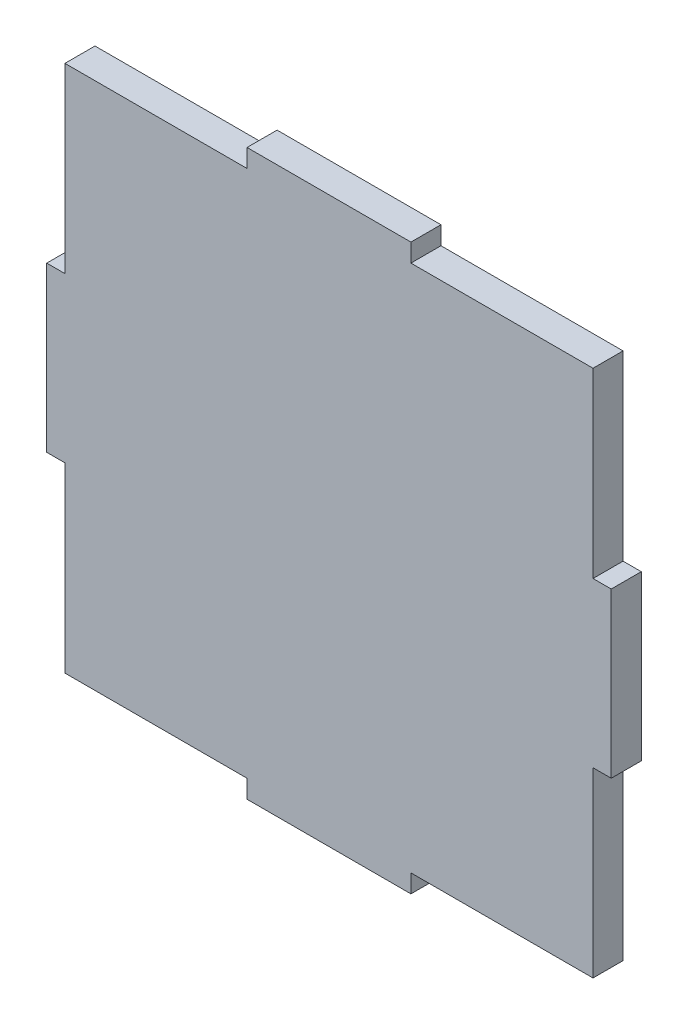
ISO-10303-21;
HEADER;
FILE_DESCRIPTION(('STEP AP214'),'2;1');
FILE_NAME('part.step','',(''),(''),'','','');
FILE_SCHEMA(('AUTOMOTIVE_DESIGN { 1 0 10303 214 1 1 1 1 }'));
ENDSEC;
DATA;
#1=APPLICATION_CONTEXT('core data for automotive mechanical design processes');
#2=APPLICATION_PROTOCOL_DEFINITION('international standard','automotive_design',2000,#1);
#3=PRODUCT_CONTEXT('',#1,'mechanical');
#4=PRODUCT('Part','Part','',(#3));
#5=PRODUCT_RELATED_PRODUCT_CATEGORY('part','',(#4));
#6=PRODUCT_DEFINITION_FORMATION('','',#4);
#7=PRODUCT_DEFINITION_CONTEXT('part definition',#1,'design');
#8=PRODUCT_DEFINITION('design','',#6,#7);
#9=PRODUCT_DEFINITION_SHAPE('','',#8);
#10=(LENGTH_UNIT() NAMED_UNIT(*) SI_UNIT(.MILLI.,.METRE.));
#11=(NAMED_UNIT(*) PLANE_ANGLE_UNIT() SI_UNIT($,.RADIAN.));
#12=(NAMED_UNIT(*) SI_UNIT($,.STERADIAN.) SOLID_ANGLE_UNIT());
#13=UNCERTAINTY_MEASURE_WITH_UNIT(LENGTH_MEASURE(1.E-05),#10,'distance_accuracy_value','');
#14=(GEOMETRIC_REPRESENTATION_CONTEXT(3) GLOBAL_UNCERTAINTY_ASSIGNED_CONTEXT((#13)) GLOBAL_UNIT_ASSIGNED_CONTEXT((#10,
#11,#12)) REPRESENTATION_CONTEXT('',''));
#15=CARTESIAN_POINT('',(0.,0.,0.));
#16=DIRECTION('',(0.,0.,1.));
#17=DIRECTION('',(1.,0.,0.));
#18=AXIS2_PLACEMENT_3D('',#15,#16,#17);
#19=CARTESIAN_POINT('',(0.,1.,1.65));
#20=DIRECTION('',(0.,1.,0.));
#21=DIRECTION('',(0.,0.,1.));
#22=AXIS2_PLACEMENT_3D('',#19,#20,#21);
#23=PLANE('',#22);
#24=DIRECTION('',(1.,0.,0.));
#25=VECTOR('',#24,1.);
#26=CARTESIAN_POINT('',(0.,1.,0.));
#27=LINE('',#26,#25);
#28=CARTESIAN_POINT('',(1.,1.,0.));
#29=VERTEX_POINT('',#28);
#30=CARTESIAN_POINT('',(11.,1.,0.));
#31=VERTEX_POINT('',#30);
#32=EDGE_CURVE('E209',#29,#31,#27,.T.);
#33=ORIENTED_EDGE('',*,*,#32,.T.);
#34=DIRECTION('',(0.,0.,-1.));
#35=VECTOR('',#34,1.);
#36=CARTESIAN_POINT('',(11.,1.,1.65));
#37=LINE('',#36,#35);
#38=CARTESIAN_POINT('',(11.,1.,1.65));
#39=VERTEX_POINT('',#38);
#40=EDGE_CURVE('E11',#39,#31,#37,.T.);
#41=ORIENTED_EDGE('',*,*,#40,.F.);
#42=DIRECTION('',(1.,0.,0.));
#43=VECTOR('',#42,1.);
#44=CARTESIAN_POINT('',(0.,1.,1.65));
#45=LINE('',#44,#43);
#46=CARTESIAN_POINT('',(1.,1.,1.65));
#47=VERTEX_POINT('',#46);
#48=EDGE_CURVE('E309',#47,#39,#45,.T.);
#49=ORIENTED_EDGE('',*,*,#48,.F.);
#50=DIRECTION('',(0.,0.,-1.));
#51=VECTOR('',#50,1.);
#52=CARTESIAN_POINT('',(1.,1.,1.65));
#53=LINE('',#52,#51);
#54=EDGE_CURVE('E55',#47,#29,#53,.T.);
#55=ORIENTED_EDGE('',*,*,#54,.T.);
#56=EDGE_LOOP('',(#33,#41,#49,#55));
#57=FACE_BOUND('',#56,.T.);
#58=ADVANCED_FACE('F38',(#57),#23,.F.);
#59=CARTESIAN_POINT('',(11.,0.,1.65));
#60=DIRECTION('',(1.,0.,0.));
#61=DIRECTION('',(0.,0.,-1.));
#62=AXIS2_PLACEMENT_3D('',#59,#60,#61);
#63=PLANE('',#62);
#64=DIRECTION('',(0.,-1.,0.));
#65=VECTOR('',#64,1.);
#66=CARTESIAN_POINT('',(11.,0.,0.));
#67=LINE('',#66,#65);
#68=CARTESIAN_POINT('',(11.,0.,0.));
#69=VERTEX_POINT('',#68);
#70=EDGE_CURVE('E211',#31,#69,#67,.T.);
#71=ORIENTED_EDGE('',*,*,#70,.T.);
#72=DIRECTION('',(0.,0.,-1.));
#73=VECTOR('',#72,1.);
#74=CARTESIAN_POINT('',(11.,0.,1.65));
#75=LINE('',#74,#73);
#76=CARTESIAN_POINT('',(11.,0.,1.65));
#77=VERTEX_POINT('',#76);
#78=EDGE_CURVE('E47',#77,#69,#75,.T.);
#79=ORIENTED_EDGE('',*,*,#78,.F.);
#80=DIRECTION('',(0.,-1.,0.));
#81=VECTOR('',#80,1.);
#82=CARTESIAN_POINT('',(11.,0.,1.65));
#83=LINE('',#82,#81);
#84=EDGE_CURVE('E130',#39,#77,#83,.T.);
#85=ORIENTED_EDGE('',*,*,#84,.F.);
#86=ORIENTED_EDGE('',*,*,#40,.T.);
#87=EDGE_LOOP('',(#71,#79,#85,#86));
#88=FACE_BOUND('',#87,.T.);
#89=ADVANCED_FACE('F40',(#88),#63,.F.);
#90=CARTESIAN_POINT('',(0.,0.,1.65));
#91=DIRECTION('',(0.,1.,0.));
#92=DIRECTION('',(0.,0.,1.));
#93=AXIS2_PLACEMENT_3D('',#90,#91,#92);
#94=PLANE('',#93);
#95=DIRECTION('',(1.,0.,0.));
#96=VECTOR('',#95,1.);
#97=CARTESIAN_POINT('',(0.,0.,0.));
#98=LINE('',#97,#96);
#99=CARTESIAN_POINT('',(20.,0.,0.));
#100=VERTEX_POINT('',#99);
#101=EDGE_CURVE('E214',#69,#100,#98,.T.);
#102=ORIENTED_EDGE('',*,*,#101,.T.);
#103=DIRECTION('',(0.,0.,-1.));
#104=VECTOR('',#103,1.);
#105=CARTESIAN_POINT('',(20.,0.,1.65));
#106=LINE('',#105,#104);
#107=CARTESIAN_POINT('',(20.,0.,1.65));
#108=VERTEX_POINT('',#107);
#109=EDGE_CURVE('E286',#108,#100,#106,.T.);
#110=ORIENTED_EDGE('',*,*,#109,.F.);
#111=DIRECTION('',(1.,0.,0.));
#112=VECTOR('',#111,1.);
#113=CARTESIAN_POINT('',(0.,0.,1.65));
#114=LINE('',#113,#112);
#115=EDGE_CURVE('E293',#77,#108,#114,.T.);
#116=ORIENTED_EDGE('',*,*,#115,.F.);
#117=ORIENTED_EDGE('',*,*,#78,.T.);
#118=EDGE_LOOP('',(#102,#110,#116,#117));
#119=FACE_BOUND('',#118,.T.);
#120=ADVANCED_FACE('F291',(#119),#94,.F.);
#121=CARTESIAN_POINT('',(20.,0.,1.65));
#122=DIRECTION('',(1.,0.,0.));
#123=DIRECTION('',(0.,0.,-1.));
#124=AXIS2_PLACEMENT_3D('',#121,#122,#123);
#125=PLANE('',#124);
#126=DIRECTION('',(0.,-1.,0.));
#127=VECTOR('',#126,1.);
#128=CARTESIAN_POINT('',(20.,0.,0.));
#129=LINE('',#128,#127);
#130=CARTESIAN_POINT('',(20.,1.,0.));
#131=VERTEX_POINT('',#130);
#132=EDGE_CURVE('E217',#131,#100,#129,.T.);
#133=ORIENTED_EDGE('',*,*,#132,.F.);
#134=DIRECTION('',(0.,0.,-1.));
#135=VECTOR('',#134,1.);
#136=CARTESIAN_POINT('',(20.,1.,1.65));
#137=LINE('',#136,#135);
#138=CARTESIAN_POINT('',(20.,1.,1.65));
#139=VERTEX_POINT('',#138);
#140=EDGE_CURVE('E284',#139,#131,#137,.T.);
#141=ORIENTED_EDGE('',*,*,#140,.F.);
#142=DIRECTION('',(0.,-1.,0.));
#143=VECTOR('',#142,1.);
#144=CARTESIAN_POINT('',(20.,0.,1.65));
#145=LINE('',#144,#143);
#146=EDGE_CURVE('E304',#139,#108,#145,.T.);
#147=ORIENTED_EDGE('',*,*,#146,.T.);
#148=ORIENTED_EDGE('',*,*,#109,.T.);
#149=EDGE_LOOP('',(#133,#141,#147,#148));
#150=FACE_BOUND('',#149,.T.);
#151=ADVANCED_FACE('F300',(#150),#125,.T.);
#152=CARTESIAN_POINT('',(30.,1.,0.));
#153=VERTEX_POINT('',#152);
#154=EDGE_CURVE('E212',#131,#153,#27,.T.);
#155=ORIENTED_EDGE('',*,*,#154,.T.);
#156=DIRECTION('',(0.,0.,-1.));
#157=VECTOR('',#156,1.);
#158=CARTESIAN_POINT('',(30.,1.,1.65));
#159=LINE('',#158,#157);
#160=CARTESIAN_POINT('',(30.,1.,1.65));
#161=VERTEX_POINT('',#160);
#162=EDGE_CURVE('E281',#161,#153,#159,.T.);
#163=ORIENTED_EDGE('',*,*,#162,.F.);
#164=EDGE_CURVE('E305',#139,#161,#45,.T.);
#165=ORIENTED_EDGE('',*,*,#164,.F.);
#166=ORIENTED_EDGE('',*,*,#140,.T.);
#167=EDGE_LOOP('',(#155,#163,#165,#166));
#168=FACE_BOUND('',#167,.T.);
#169=ADVANCED_FACE('F344',(#168),#23,.F.);
#170=CARTESIAN_POINT('',(30.,0.,1.65));
#171=DIRECTION('',(-1.,0.,0.));
#172=DIRECTION('',(0.,0.,1.));
#173=AXIS2_PLACEMENT_3D('',#170,#171,#172);
#174=PLANE('',#173);
#175=DIRECTION('',(0.,1.,0.));
#176=VECTOR('',#175,1.);
#177=CARTESIAN_POINT('',(30.,0.,0.));
#178=LINE('',#177,#176);
#179=CARTESIAN_POINT('',(30.,11.,0.));
#180=VERTEX_POINT('',#179);
#181=EDGE_CURVE('E220',#153,#180,#178,.T.);
#182=ORIENTED_EDGE('',*,*,#181,.T.);
#183=DIRECTION('',(0.,0.,-1.));
#184=VECTOR('',#183,1.);
#185=CARTESIAN_POINT('',(30.,11.,1.65));
#186=LINE('',#185,#184);
#187=CARTESIAN_POINT('',(30.,11.,1.65));
#188=VERTEX_POINT('',#187);
#189=EDGE_CURVE('E278',#188,#180,#186,.T.);
#190=ORIENTED_EDGE('',*,*,#189,.F.);
#191=DIRECTION('',(0.,1.,0.));
#192=VECTOR('',#191,1.);
#193=CARTESIAN_POINT('',(30.,0.,1.65));
#194=LINE('',#193,#192);
#195=EDGE_CURVE('E307',#161,#188,#194,.T.);
#196=ORIENTED_EDGE('',*,*,#195,.F.);
#197=ORIENTED_EDGE('',*,*,#162,.T.);
#198=EDGE_LOOP('',(#182,#190,#196,#197));
#199=FACE_BOUND('',#198,.T.);
#200=ADVANCED_FACE('F350',(#199),#174,.F.);
#201=CARTESIAN_POINT('',(0.,11.,1.65));
#202=DIRECTION('',(0.,1.,0.));
#203=DIRECTION('',(0.,0.,1.));
#204=AXIS2_PLACEMENT_3D('',#201,#202,#203);
#205=PLANE('',#204);
#206=DIRECTION('',(1.,0.,0.));
#207=VECTOR('',#206,1.);
#208=CARTESIAN_POINT('',(0.,11.,0.));
#209=LINE('',#208,#207);
#210=CARTESIAN_POINT('',(31.,11.,0.));
#211=VERTEX_POINT('',#210);
#212=EDGE_CURVE('E222',#180,#211,#209,.T.);
#213=ORIENTED_EDGE('',*,*,#212,.T.);
#214=DIRECTION('',(0.,0.,-1.));
#215=VECTOR('',#214,1.);
#216=CARTESIAN_POINT('',(31.,11.,1.65));
#217=LINE('',#216,#215);
#218=CARTESIAN_POINT('',(31.,11.,1.65));
#219=VERTEX_POINT('',#218);
#220=EDGE_CURVE('E275',#219,#211,#217,.T.);
#221=ORIENTED_EDGE('',*,*,#220,.F.);
#222=DIRECTION('',(1.,0.,0.));
#223=VECTOR('',#222,1.);
#224=CARTESIAN_POINT('',(0.,11.,1.65));
#225=LINE('',#224,#223);
#226=EDGE_CURVE('E314',#188,#219,#225,.T.);
#227=ORIENTED_EDGE('',*,*,#226,.F.);
#228=ORIENTED_EDGE('',*,*,#189,.T.);
#229=EDGE_LOOP('',(#213,#221,#227,#228));
#230=FACE_BOUND('',#229,.T.);
#231=ADVANCED_FACE('F356',(#230),#205,.F.);
#232=CARTESIAN_POINT('',(31.,0.,1.65));
#233=DIRECTION('',(-1.,0.,0.));
#234=DIRECTION('',(0.,0.,1.));
#235=AXIS2_PLACEMENT_3D('',#232,#233,#234);
#236=PLANE('',#235);
#237=DIRECTION('',(0.,1.,0.));
#238=VECTOR('',#237,1.);
#239=CARTESIAN_POINT('',(31.,0.,0.));
#240=LINE('',#239,#238);
#241=CARTESIAN_POINT('',(31.,20.,0.));
#242=VERTEX_POINT('',#241);
#243=EDGE_CURVE('E225',#211,#242,#240,.T.);
#244=ORIENTED_EDGE('',*,*,#243,.T.);
#245=DIRECTION('',(0.,0.,-1.));
#246=VECTOR('',#245,1.);
#247=CARTESIAN_POINT('',(31.,20.,1.65));
#248=LINE('',#247,#246);
#249=CARTESIAN_POINT('',(31.,20.,1.65));
#250=VERTEX_POINT('',#249);
#251=EDGE_CURVE('E273',#250,#242,#248,.T.);
#252=ORIENTED_EDGE('',*,*,#251,.F.);
#253=DIRECTION('',(0.,1.,0.));
#254=VECTOR('',#253,1.);
#255=CARTESIAN_POINT('',(31.,0.,1.65));
#256=LINE('',#255,#254);
#257=EDGE_CURVE('E317',#219,#250,#256,.T.);
#258=ORIENTED_EDGE('',*,*,#257,.F.);
#259=ORIENTED_EDGE('',*,*,#220,.T.);
#260=EDGE_LOOP('',(#244,#252,#258,#259));
#261=FACE_BOUND('',#260,.T.);
#262=ADVANCED_FACE('F370',(#261),#236,.F.);
#263=CARTESIAN_POINT('',(0.,20.,1.65));
#264=DIRECTION('',(0.,1.,0.));
#265=DIRECTION('',(0.,0.,1.));
#266=AXIS2_PLACEMENT_3D('',#263,#264,#265);
#267=PLANE('',#266);
#268=DIRECTION('',(1.,0.,0.));
#269=VECTOR('',#268,1.);
#270=CARTESIAN_POINT('',(0.,20.,0.));
#271=LINE('',#270,#269);
#272=CARTESIAN_POINT('',(30.,20.,0.));
#273=VERTEX_POINT('',#272);
#274=EDGE_CURVE('E228',#273,#242,#271,.T.);
#275=ORIENTED_EDGE('',*,*,#274,.F.);
#276=DIRECTION('',(0.,0.,-1.));
#277=VECTOR('',#276,1.);
#278=CARTESIAN_POINT('',(30.,20.,1.65));
#279=LINE('',#278,#277);
#280=CARTESIAN_POINT('',(30.,20.,1.65));
#281=VERTEX_POINT('',#280);
#282=EDGE_CURVE('E271',#281,#273,#279,.T.);
#283=ORIENTED_EDGE('',*,*,#282,.F.);
#284=DIRECTION('',(1.,0.,0.));
#285=VECTOR('',#284,1.);
#286=CARTESIAN_POINT('',(0.,20.,1.65));
#287=LINE('',#286,#285);
#288=EDGE_CURVE('E319',#281,#250,#287,.T.);
#289=ORIENTED_EDGE('',*,*,#288,.T.);
#290=ORIENTED_EDGE('',*,*,#251,.T.);
#291=EDGE_LOOP('',(#275,#283,#289,#290));
#292=FACE_BOUND('',#291,.T.);
#293=ADVANCED_FACE('F378',(#292),#267,.T.);
#294=CARTESIAN_POINT('',(30.,30.,0.));
#295=VERTEX_POINT('',#294);
#296=EDGE_CURVE('E223',#273,#295,#178,.T.);
#297=ORIENTED_EDGE('',*,*,#296,.T.);
#298=DIRECTION('',(0.,0.,-1.));
#299=VECTOR('',#298,1.);
#300=CARTESIAN_POINT('',(30.,30.,1.65));
#301=LINE('',#300,#299);
#302=CARTESIAN_POINT('',(30.,30.,1.65));
#303=VERTEX_POINT('',#302);
#304=EDGE_CURVE('E269',#303,#295,#301,.T.);
#305=ORIENTED_EDGE('',*,*,#304,.F.);
#306=EDGE_CURVE('E315',#281,#303,#194,.T.);
#307=ORIENTED_EDGE('',*,*,#306,.F.);
#308=ORIENTED_EDGE('',*,*,#282,.T.);
#309=EDGE_LOOP('',(#297,#305,#307,#308));
#310=FACE_BOUND('',#309,.T.);
#311=ADVANCED_FACE('F359',(#310),#174,.F.);
#312=CARTESIAN_POINT('',(0.,30.,1.65));
#313=DIRECTION('',(0.,1.,0.));
#314=DIRECTION('',(-1.,0.,0.));
#315=AXIS2_PLACEMENT_3D('',#312,#313,#314);
#316=PLANE('',#315);
#317=DIRECTION('',(1.,0.,0.));
#318=VECTOR('',#317,1.);
#319=CARTESIAN_POINT('',(0.,30.,0.));
#320=LINE('',#319,#318);
#321=CARTESIAN_POINT('',(20.,30.,0.));
#322=VERTEX_POINT('',#321);
#323=EDGE_CURVE('E231',#322,#295,#320,.T.);
#324=ORIENTED_EDGE('',*,*,#323,.F.);
#325=DIRECTION('',(0.,0.,-1.));
#326=VECTOR('',#325,1.);
#327=CARTESIAN_POINT('',(20.,30.,1.65));
#328=LINE('',#327,#326);
#329=CARTESIAN_POINT('',(20.,30.,1.65));
#330=VERTEX_POINT('',#329);
#331=EDGE_CURVE('E267',#330,#322,#328,.T.);
#332=ORIENTED_EDGE('',*,*,#331,.F.);
#333=DIRECTION('',(1.,0.,0.));
#334=VECTOR('',#333,1.);
#335=CARTESIAN_POINT('',(0.,30.,1.65));
#336=LINE('',#335,#334);
#337=EDGE_CURVE('E322',#330,#303,#336,.T.);
#338=ORIENTED_EDGE('',*,*,#337,.T.);
#339=ORIENTED_EDGE('',*,*,#304,.T.);
#340=EDGE_LOOP('',(#324,#332,#338,#339));
#341=FACE_BOUND('',#340,.T.);
#342=ADVANCED_FACE('F384',(#341),#316,.T.);
#343=CARTESIAN_POINT('',(20.,0.,1.65));
#344=DIRECTION('',(1.,0.,0.));
#345=DIRECTION('',(0.,0.,-1.));
#346=AXIS2_PLACEMENT_3D('',#343,#344,#345);
#347=PLANE('',#346);
#348=DIRECTION('',(0.,-1.,0.));
#349=VECTOR('',#348,1.);
#350=CARTESIAN_POINT('',(20.,0.,0.));
#351=LINE('',#350,#349);
#352=CARTESIAN_POINT('',(20.,31.,0.));
#353=VERTEX_POINT('',#352);
#354=EDGE_CURVE('E234',#353,#322,#351,.T.);
#355=ORIENTED_EDGE('',*,*,#354,.F.);
#356=DIRECTION('',(0.,0.,-1.));
#357=VECTOR('',#356,1.);
#358=CARTESIAN_POINT('',(20.,31.,1.65));
#359=LINE('',#358,#357);
#360=CARTESIAN_POINT('',(20.,31.,1.65));
#361=VERTEX_POINT('',#360);
#362=EDGE_CURVE('E265',#361,#353,#359,.T.);
#363=ORIENTED_EDGE('',*,*,#362,.F.);
#364=DIRECTION('',(0.,-1.,0.));
#365=VECTOR('',#364,1.);
#366=CARTESIAN_POINT('',(20.,0.,1.65));
#367=LINE('',#366,#365);
#368=EDGE_CURVE('E325',#361,#330,#367,.T.);
#369=ORIENTED_EDGE('',*,*,#368,.T.);
#370=ORIENTED_EDGE('',*,*,#331,.T.);
#371=EDGE_LOOP('',(#355,#363,#369,#370));
#372=FACE_BOUND('',#371,.T.);
#373=ADVANCED_FACE('F389',(#372),#347,.T.);
#374=CARTESIAN_POINT('',(0.,31.,1.65));
#375=DIRECTION('',(0.,1.,0.));
#376=DIRECTION('',(0.,0.,1.));
#377=AXIS2_PLACEMENT_3D('',#374,#375,#376);
#378=PLANE('',#377);
#379=DIRECTION('',(1.,0.,0.));
#380=VECTOR('',#379,1.);
#381=CARTESIAN_POINT('',(0.,31.,0.));
#382=LINE('',#381,#380);
#383=CARTESIAN_POINT('',(11.,31.,0.));
#384=VERTEX_POINT('',#383);
#385=EDGE_CURVE('E238',#384,#353,#382,.T.);
#386=ORIENTED_EDGE('',*,*,#385,.F.);
#387=DIRECTION('',(0.,0.,-1.));
#388=VECTOR('',#387,1.);
#389=CARTESIAN_POINT('',(11.,31.,1.65));
#390=LINE('',#389,#388);
#391=CARTESIAN_POINT('',(11.,31.,1.65));
#392=VERTEX_POINT('',#391);
#393=EDGE_CURVE('E263',#392,#384,#390,.T.);
#394=ORIENTED_EDGE('',*,*,#393,.F.);
#395=DIRECTION('',(1.,0.,0.));
#396=VECTOR('',#395,1.);
#397=CARTESIAN_POINT('',(0.,31.,1.65));
#398=LINE('',#397,#396);
#399=EDGE_CURVE('E329',#392,#361,#398,.T.);
#400=ORIENTED_EDGE('',*,*,#399,.T.);
#401=ORIENTED_EDGE('',*,*,#362,.T.);
#402=EDGE_LOOP('',(#386,#394,#400,#401));
#403=FACE_BOUND('',#402,.T.);
#404=ADVANCED_FACE('F392',(#403),#378,.T.);
#405=CARTESIAN_POINT('',(11.,0.,1.65));
#406=DIRECTION('',(1.,0.,0.));
#407=DIRECTION('',(0.,0.,-1.));
#408=AXIS2_PLACEMENT_3D('',#405,#406,#407);
#409=PLANE('',#408);
#410=DIRECTION('',(0.,-1.,0.));
#411=VECTOR('',#410,1.);
#412=CARTESIAN_POINT('',(11.,0.,0.));
#413=LINE('',#412,#411);
#414=CARTESIAN_POINT('',(11.,30.,0.));
#415=VERTEX_POINT('',#414);
#416=EDGE_CURVE('E241',#384,#415,#413,.T.);
#417=ORIENTED_EDGE('',*,*,#416,.T.);
#418=DIRECTION('',(0.,0.,-1.));
#419=VECTOR('',#418,1.);
#420=CARTESIAN_POINT('',(11.,30.,1.65));
#421=LINE('',#420,#419);
#422=CARTESIAN_POINT('',(11.,30.,1.65));
#423=VERTEX_POINT('',#422);
#424=EDGE_CURVE('E261',#423,#415,#421,.T.);
#425=ORIENTED_EDGE('',*,*,#424,.F.);
#426=DIRECTION('',(0.,-1.,0.));
#427=VECTOR('',#426,1.);
#428=CARTESIAN_POINT('',(11.,0.,1.65));
#429=LINE('',#428,#427);
#430=EDGE_CURVE('E332',#392,#423,#429,.T.);
#431=ORIENTED_EDGE('',*,*,#430,.F.);
#432=ORIENTED_EDGE('',*,*,#393,.T.);
#433=EDGE_LOOP('',(#417,#425,#431,#432));
#434=FACE_BOUND('',#433,.T.);
#435=ADVANCED_FACE('F397',(#434),#409,.F.);
#436=CARTESIAN_POINT('',(1.,30.,0.));
#437=VERTEX_POINT('',#436);
#438=EDGE_CURVE('E235',#437,#415,#320,.T.);
#439=ORIENTED_EDGE('',*,*,#438,.F.);
#440=DIRECTION('',(0.,0.,-1.));
#441=VECTOR('',#440,1.);
#442=CARTESIAN_POINT('',(1.,30.,1.65));
#443=LINE('',#442,#441);
#444=CARTESIAN_POINT('',(1.,30.,1.65));
#445=VERTEX_POINT('',#444);
#446=EDGE_CURVE('E259',#445,#437,#443,.T.);
#447=ORIENTED_EDGE('',*,*,#446,.F.);
#448=EDGE_CURVE('E326',#445,#423,#336,.T.);
#449=ORIENTED_EDGE('',*,*,#448,.T.);
#450=ORIENTED_EDGE('',*,*,#424,.T.);
#451=EDGE_LOOP('',(#439,#447,#449,#450));
#452=FACE_BOUND('',#451,.T.);
#453=ADVANCED_FACE('F402',(#452),#316,.T.);
#454=CARTESIAN_POINT('',(1.,0.,1.65));
#455=DIRECTION('',(-1.,0.,0.));
#456=DIRECTION('',(0.,0.,1.));
#457=AXIS2_PLACEMENT_3D('',#454,#455,#456);
#458=PLANE('',#457);
#459=DIRECTION('',(0.,1.,0.));
#460=VECTOR('',#459,1.);
#461=CARTESIAN_POINT('',(1.,0.,0.));
#462=LINE('',#461,#460);
#463=CARTESIAN_POINT('',(1.,20.,0.));
#464=VERTEX_POINT('',#463);
#465=EDGE_CURVE('E244',#464,#437,#462,.T.);
#466=ORIENTED_EDGE('',*,*,#465,.F.);
#467=DIRECTION('',(0.,0.,-1.));
#468=VECTOR('',#467,1.);
#469=CARTESIAN_POINT('',(1.,20.,1.65));
#470=LINE('',#469,#468);
#471=CARTESIAN_POINT('',(1.,20.,1.65));
#472=VERTEX_POINT('',#471);
#473=EDGE_CURVE('E257',#472,#464,#470,.T.);
#474=ORIENTED_EDGE('',*,*,#473,.F.);
#475=DIRECTION('',(0.,1.,0.));
#476=VECTOR('',#475,1.);
#477=CARTESIAN_POINT('',(1.,0.,1.65));
#478=LINE('',#477,#476);
#479=EDGE_CURVE('E205',#472,#445,#478,.T.);
#480=ORIENTED_EDGE('',*,*,#479,.T.);
#481=ORIENTED_EDGE('',*,*,#446,.T.);
#482=EDGE_LOOP('',(#466,#474,#480,#481));
#483=FACE_BOUND('',#482,.T.);
#484=ADVANCED_FACE('F404',(#483),#458,.T.);
#485=CARTESIAN_POINT('',(0.,20.,1.65));
#486=DIRECTION('',(0.,1.,0.));
#487=DIRECTION('',(0.,0.,1.));
#488=AXIS2_PLACEMENT_3D('',#485,#486,#487);
#489=PLANE('',#488);
#490=DIRECTION('',(1.,0.,0.));
#491=VECTOR('',#490,1.);
#492=CARTESIAN_POINT('',(0.,20.,0.));
#493=LINE('',#492,#491);
#494=CARTESIAN_POINT('',(0.,20.,0.));
#495=VERTEX_POINT('',#494);
#496=EDGE_CURVE('E247',#495,#464,#493,.T.);
#497=ORIENTED_EDGE('',*,*,#496,.F.);
#498=DIRECTION('',(0.,0.,-1.));
#499=VECTOR('',#498,1.);
#500=CARTESIAN_POINT('',(0.,20.,1.65));
#501=LINE('',#500,#499);
#502=CARTESIAN_POINT('',(0.,20.,1.65));
#503=VERTEX_POINT('',#502);
#504=EDGE_CURVE('E191',#503,#495,#501,.T.);
#505=ORIENTED_EDGE('',*,*,#504,.F.);
#506=DIRECTION('',(1.,0.,0.));
#507=VECTOR('',#506,1.);
#508=CARTESIAN_POINT('',(0.,20.,1.65));
#509=LINE('',#508,#507);
#510=EDGE_CURVE('E203',#503,#472,#509,.T.);
#511=ORIENTED_EDGE('',*,*,#510,.T.);
#512=ORIENTED_EDGE('',*,*,#473,.T.);
#513=EDGE_LOOP('',(#497,#505,#511,#512));
#514=FACE_BOUND('',#513,.T.);
#515=ADVANCED_FACE('F407',(#514),#489,.T.);
#516=CARTESIAN_POINT('',(0.,0.,1.65));
#517=DIRECTION('',(-1.,0.,0.));
#518=DIRECTION('',(0.,0.,1.));
#519=AXIS2_PLACEMENT_3D('',#516,#517,#518);
#520=PLANE('',#519);
#521=DIRECTION('',(0.,1.,0.));
#522=VECTOR('',#521,1.);
#523=CARTESIAN_POINT('',(0.,0.,0.));
#524=LINE('',#523,#522);
#525=CARTESIAN_POINT('',(0.,11.,0.));
#526=VERTEX_POINT('',#525);
#527=EDGE_CURVE('E188',#526,#495,#524,.T.);
#528=ORIENTED_EDGE('',*,*,#527,.F.);
#529=DIRECTION('',(0.,0.,-1.));
#530=VECTOR('',#529,1.);
#531=CARTESIAN_POINT('',(0.,11.,1.65));
#532=LINE('',#531,#530);
#533=CARTESIAN_POINT('',(0.,11.,1.65));
#534=VERTEX_POINT('',#533);
#535=EDGE_CURVE('E182',#534,#526,#532,.T.);
#536=ORIENTED_EDGE('',*,*,#535,.F.);
#537=DIRECTION('',(0.,1.,0.));
#538=VECTOR('',#537,1.);
#539=CARTESIAN_POINT('',(0.,0.,1.65));
#540=LINE('',#539,#538);
#541=EDGE_CURVE('E186',#534,#503,#540,.T.);
#542=ORIENTED_EDGE('',*,*,#541,.T.);
#543=ORIENTED_EDGE('',*,*,#504,.T.);
#544=EDGE_LOOP('',(#528,#536,#542,#543));
#545=FACE_BOUND('',#544,.T.);
#546=ADVANCED_FACE('F184',(#545),#520,.T.);
#547=CARTESIAN_POINT('',(0.,11.,1.65));
#548=DIRECTION('',(0.,1.,0.));
#549=DIRECTION('',(0.,0.,1.));
#550=AXIS2_PLACEMENT_3D('',#547,#548,#549);
#551=PLANE('',#550);
#552=DIRECTION('',(1.,0.,0.));
#553=VECTOR('',#552,1.);
#554=CARTESIAN_POINT('',(0.,11.,0.));
#555=LINE('',#554,#553);
#556=CARTESIAN_POINT('',(1.,11.,0.));
#557=VERTEX_POINT('',#556);
#558=EDGE_CURVE('E252',#526,#557,#555,.T.);
#559=ORIENTED_EDGE('',*,*,#558,.T.);
#560=DIRECTION('',(0.,0.,-1.));
#561=VECTOR('',#560,1.);
#562=CARTESIAN_POINT('',(1.,11.,1.65));
#563=LINE('',#562,#561);
#564=CARTESIAN_POINT('',(1.,11.,1.65));
#565=VERTEX_POINT('',#564);
#566=EDGE_CURVE('E118',#565,#557,#563,.T.);
#567=ORIENTED_EDGE('',*,*,#566,.F.);
#568=DIRECTION('',(1.,0.,0.));
#569=VECTOR('',#568,1.);
#570=CARTESIAN_POINT('',(0.,11.,1.65));
#571=LINE('',#570,#569);
#572=EDGE_CURVE('E193',#534,#565,#571,.T.);
#573=ORIENTED_EDGE('',*,*,#572,.F.);
#574=ORIENTED_EDGE('',*,*,#535,.T.);
#575=EDGE_LOOP('',(#559,#567,#573,#574));
#576=FACE_BOUND('',#575,.T.);
#577=ADVANCED_FACE('F194',(#576),#551,.F.);
#578=EDGE_CURVE('E248',#29,#557,#462,.T.);
#579=ORIENTED_EDGE('',*,*,#578,.F.);
#580=ORIENTED_EDGE('',*,*,#54,.F.);
#581=EDGE_CURVE('E197',#47,#565,#478,.T.);
#582=ORIENTED_EDGE('',*,*,#581,.T.);
#583=ORIENTED_EDGE('',*,*,#566,.T.);
#584=EDGE_LOOP('',(#579,#580,#582,#583));
#585=FACE_BOUND('',#584,.T.);
#586=ADVANCED_FACE('F336',(#585),#458,.T.);
#587=CARTESIAN_POINT('',(0.,0.,1.65));
#588=DIRECTION('',(0.,0.,1.));
#589=DIRECTION('',(1.,0.,0.));
#590=AXIS2_PLACEMENT_3D('',#587,#588,#589);
#591=PLANE('',#590);
#592=ORIENTED_EDGE('',*,*,#48,.T.);
#593=ORIENTED_EDGE('',*,*,#84,.T.);
#594=ORIENTED_EDGE('',*,*,#115,.T.);
#595=ORIENTED_EDGE('',*,*,#146,.F.);
#596=ORIENTED_EDGE('',*,*,#164,.T.);
#597=ORIENTED_EDGE('',*,*,#195,.T.);
#598=ORIENTED_EDGE('',*,*,#226,.T.);
#599=ORIENTED_EDGE('',*,*,#257,.T.);
#600=ORIENTED_EDGE('',*,*,#288,.F.);
#601=ORIENTED_EDGE('',*,*,#306,.T.);
#602=ORIENTED_EDGE('',*,*,#337,.F.);
#603=ORIENTED_EDGE('',*,*,#368,.F.);
#604=ORIENTED_EDGE('',*,*,#399,.F.);
#605=ORIENTED_EDGE('',*,*,#430,.T.);
#606=ORIENTED_EDGE('',*,*,#448,.F.);
#607=ORIENTED_EDGE('',*,*,#479,.F.);
#608=ORIENTED_EDGE('',*,*,#510,.F.);
#609=ORIENTED_EDGE('',*,*,#541,.F.);
#610=ORIENTED_EDGE('',*,*,#572,.T.);
#611=ORIENTED_EDGE('',*,*,#581,.F.);
#612=EDGE_LOOP('',(#592,#593,#594,#595,#596,#597,#598,#599,#600,#601,#602,#603,#604,#605,#606,
#607,#608,#609,#610,#611));
#613=FACE_BOUND('',#612,.T.);
#614=ADVANCED_FACE('F200',(#613),#591,.T.);
#615=CARTESIAN_POINT('',(0.,0.,0.));
#616=DIRECTION('',(0.,0.,1.));
#617=DIRECTION('',(1.,0.,0.));
#618=AXIS2_PLACEMENT_3D('',#615,#616,#617);
#619=PLANE('',#618);
#620=ORIENTED_EDGE('',*,*,#32,.F.);
#621=ORIENTED_EDGE('',*,*,#578,.T.);
#622=ORIENTED_EDGE('',*,*,#558,.F.);
#623=ORIENTED_EDGE('',*,*,#527,.T.);
#624=ORIENTED_EDGE('',*,*,#496,.T.);
#625=ORIENTED_EDGE('',*,*,#465,.T.);
#626=ORIENTED_EDGE('',*,*,#438,.T.);
#627=ORIENTED_EDGE('',*,*,#416,.F.);
#628=ORIENTED_EDGE('',*,*,#385,.T.);
#629=ORIENTED_EDGE('',*,*,#354,.T.);
#630=ORIENTED_EDGE('',*,*,#323,.T.);
#631=ORIENTED_EDGE('',*,*,#296,.F.);
#632=ORIENTED_EDGE('',*,*,#274,.T.);
#633=ORIENTED_EDGE('',*,*,#243,.F.);
#634=ORIENTED_EDGE('',*,*,#212,.F.);
#635=ORIENTED_EDGE('',*,*,#181,.F.);
#636=ORIENTED_EDGE('',*,*,#154,.F.);
#637=ORIENTED_EDGE('',*,*,#132,.T.);
#638=ORIENTED_EDGE('',*,*,#101,.F.);
#639=ORIENTED_EDGE('',*,*,#70,.F.);
#640=EDGE_LOOP('',(#620,#621,#622,#623,#624,#625,#626,#627,#628,#629,#630,#631,#632,#633,#634,
#635,#636,#637,#638,#639));
#641=FACE_BOUND('',#640,.T.);
#642=ADVANCED_FACE('F295',(#641),#619,.F.);
#643=CLOSED_SHELL('',(#58,#89,#120,#151,#169,#200,#231,#262,#293,#311,#342,#373,#404,#435,#453,
#484,#515,#546,#577,#586,#614,#642));
#644=MANIFOLD_SOLID_BREP('B2',#643);
#645=ADVANCED_BREP_SHAPE_REPRESENTATION('',(#18,#644),#14);
#646=SHAPE_DEFINITION_REPRESENTATION(#9,#645);
ENDSEC;
END-ISO-10303-21;
